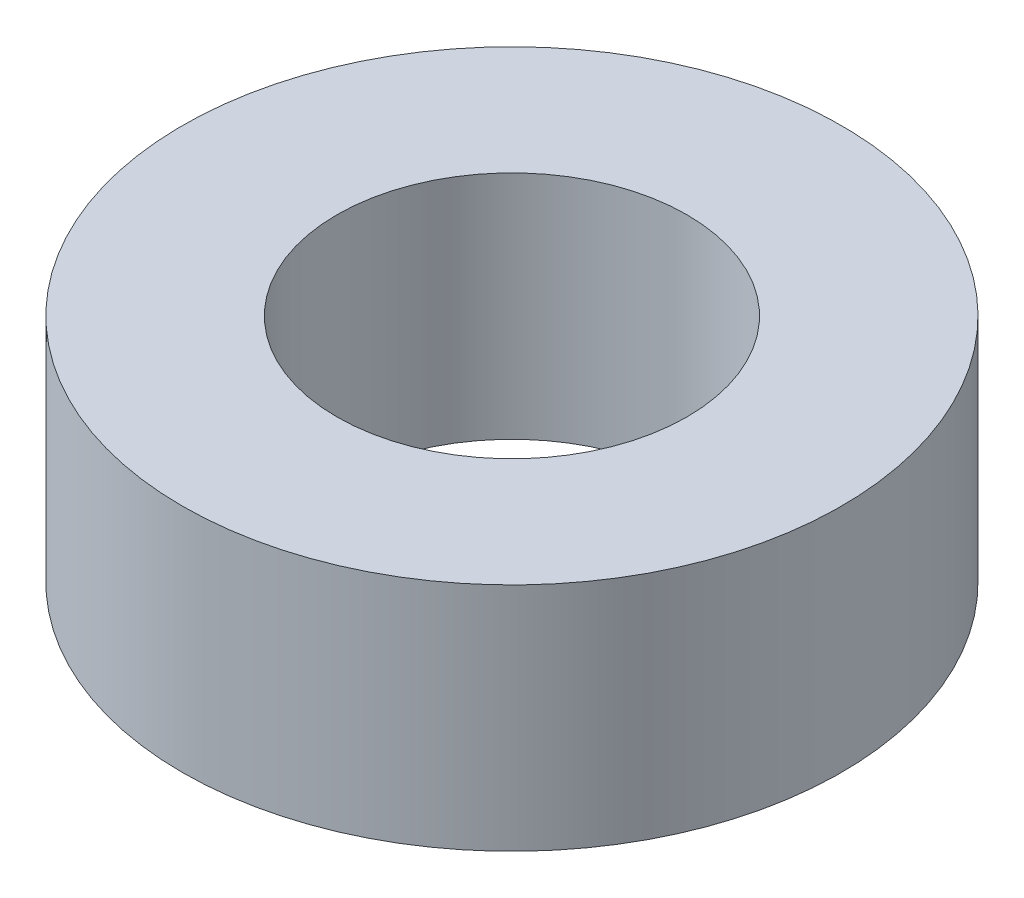
ISO-10303-21;
HEADER;
FILE_DESCRIPTION(('STEP AP214'),'2;1');
FILE_NAME('part.step','',(''),(''),'','','');
FILE_SCHEMA(('AUTOMOTIVE_DESIGN { 1 0 10303 214 1 1 1 1 }'));
ENDSEC;
DATA;
#1=APPLICATION_CONTEXT('core data for automotive mechanical design processes');
#2=APPLICATION_PROTOCOL_DEFINITION('international standard','automotive_design',2000,#1);
#3=PRODUCT_CONTEXT('',#1,'mechanical');
#4=PRODUCT('Part','Part','',(#3));
#5=PRODUCT_RELATED_PRODUCT_CATEGORY('part','',(#4));
#6=PRODUCT_DEFINITION_FORMATION('','',#4);
#7=PRODUCT_DEFINITION_CONTEXT('part definition',#1,'design');
#8=PRODUCT_DEFINITION('design','',#6,#7);
#9=PRODUCT_DEFINITION_SHAPE('','',#8);
#10=(LENGTH_UNIT() NAMED_UNIT(*) SI_UNIT(.MILLI.,.METRE.));
#11=(NAMED_UNIT(*) PLANE_ANGLE_UNIT() SI_UNIT($,.RADIAN.));
#12=(NAMED_UNIT(*) SI_UNIT($,.STERADIAN.) SOLID_ANGLE_UNIT());
#13=UNCERTAINTY_MEASURE_WITH_UNIT(LENGTH_MEASURE(1.E-05),#10,'distance_accuracy_value','');
#14=(GEOMETRIC_REPRESENTATION_CONTEXT(3) GLOBAL_UNCERTAINTY_ASSIGNED_CONTEXT((#13)) GLOBAL_UNIT_ASSIGNED_CONTEXT((#10,
#11,#12)) REPRESENTATION_CONTEXT('',''));
#15=CARTESIAN_POINT('',(0.,0.,0.));
#16=DIRECTION('',(0.,0.,1.));
#17=DIRECTION('',(1.,0.,0.));
#18=AXIS2_PLACEMENT_3D('',#15,#16,#17);
#19=CARTESIAN_POINT('',(0.,2.8,0.));
#20=DIRECTION('',(0.,1.,0.));
#21=DIRECTION('',(0.,0.,1.));
#22=AXIS2_PLACEMENT_3D('',#19,#20,#21);
#23=PLANE('',#22);
#24=CARTESIAN_POINT('',(0.,2.8,0.));
#25=DIRECTION('',(0.,1.,0.));
#26=DIRECTION('',(0.,0.,1.));
#27=AXIS2_PLACEMENT_3D('',#24,#25,#26);
#28=CIRCLE('',#27,4.);
#29=CARTESIAN_POINT('',(0.,2.8,4.));
#30=VERTEX_POINT('',#29);
#31=EDGE_CURVE('E10',#30,#30,#28,.T.);
#32=ORIENTED_EDGE('',*,*,#31,.T.);
#33=EDGE_LOOP('',(#32));
#34=FACE_BOUND('',#33,.T.);
#35=CARTESIAN_POINT('',(0.,2.8,0.));
#36=DIRECTION('',(0.,1.,0.));
#37=DIRECTION('',(0.,0.,1.));
#38=AXIS2_PLACEMENT_3D('',#35,#36,#37);
#39=CIRCLE('',#38,2.125);
#40=CARTESIAN_POINT('',(0.,2.8,2.125));
#41=VERTEX_POINT('',#40);
#42=EDGE_CURVE('E46',#41,#41,#39,.T.);
#43=ORIENTED_EDGE('',*,*,#42,.F.);
#44=EDGE_LOOP('',(#43));
#45=FACE_BOUND('',#44,.T.);
#46=ADVANCED_FACE('F35',(#34,#45),#23,.T.);
#47=CARTESIAN_POINT('',(0.,0.,0.));
#48=DIRECTION('',(0.,1.,0.));
#49=DIRECTION('',(0.,0.,1.));
#50=AXIS2_PLACEMENT_3D('',#47,#48,#49);
#51=PLANE('',#50);
#52=CARTESIAN_POINT('',(0.,0.,0.));
#53=DIRECTION('',(0.,1.,0.));
#54=DIRECTION('',(0.,0.,1.));
#55=AXIS2_PLACEMENT_3D('',#52,#53,#54);
#56=CIRCLE('',#55,4.);
#57=CARTESIAN_POINT('',(0.,0.,4.));
#58=VERTEX_POINT('',#57);
#59=EDGE_CURVE('E39',#58,#58,#56,.T.);
#60=ORIENTED_EDGE('',*,*,#59,.F.);
#61=EDGE_LOOP('',(#60));
#62=FACE_BOUND('',#61,.T.);
#63=CARTESIAN_POINT('',(0.,0.,0.));
#64=DIRECTION('',(0.,1.,0.));
#65=DIRECTION('',(0.,0.,1.));
#66=AXIS2_PLACEMENT_3D('',#63,#64,#65);
#67=CIRCLE('',#66,2.125);
#68=CARTESIAN_POINT('',(0.,0.,2.125));
#69=VERTEX_POINT('',#68);
#70=EDGE_CURVE('E48',#69,#69,#67,.T.);
#71=ORIENTED_EDGE('',*,*,#70,.T.);
#72=EDGE_LOOP('',(#71));
#73=FACE_BOUND('',#72,.T.);
#74=ADVANCED_FACE('F58',(#62,#73),#51,.F.);
#75=CARTESIAN_POINT('',(0.,2.8,0.));
#76=DIRECTION('',(0.,-1.,0.));
#77=DIRECTION('',(0.,0.,-1.));
#78=AXIS2_PLACEMENT_3D('',#75,#76,#77);
#79=CYLINDRICAL_SURFACE('',#78,4.);
#80=ORIENTED_EDGE('',*,*,#31,.F.);
#81=EDGE_LOOP('',(#80));
#82=FACE_BOUND('',#81,.T.);
#83=ORIENTED_EDGE('',*,*,#59,.T.);
#84=EDGE_LOOP('',(#83));
#85=FACE_BOUND('',#84,.T.);
#86=ADVANCED_FACE('F37',(#82,#85),#79,.T.);
#87=CARTESIAN_POINT('',(0.,2.8,0.));
#88=DIRECTION('',(0.,-1.,0.));
#89=DIRECTION('',(0.,0.,-1.));
#90=AXIS2_PLACEMENT_3D('',#87,#88,#89);
#91=CYLINDRICAL_SURFACE('',#90,2.125);
#92=ORIENTED_EDGE('',*,*,#42,.T.);
#93=EDGE_LOOP('',(#92));
#94=FACE_BOUND('',#93,.T.);
#95=ORIENTED_EDGE('',*,*,#70,.F.);
#96=EDGE_LOOP('',(#95));
#97=FACE_BOUND('',#96,.T.);
#98=ADVANCED_FACE('F54',(#94,#97),#91,.F.);
#99=CLOSED_SHELL('',(#46,#74,#86,#98));
#100=MANIFOLD_SOLID_BREP('B2',#99);
#101=ADVANCED_BREP_SHAPE_REPRESENTATION('',(#18,#100),#14);
#102=SHAPE_DEFINITION_REPRESENTATION(#9,#101);
ENDSEC;
END-ISO-10303-21;
